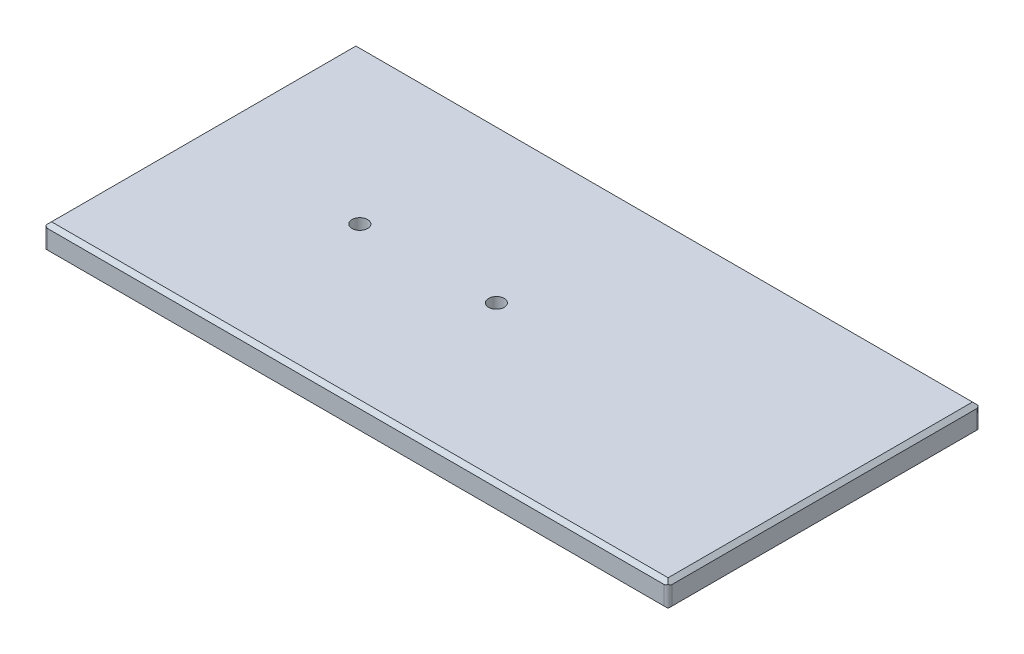
ISO-10303-21;
HEADER;
FILE_DESCRIPTION(('STEP AP214'),'2;1');
FILE_NAME('part.step','',(''),(''),'','','');
FILE_SCHEMA(('AUTOMOTIVE_DESIGN { 1 0 10303 214 1 1 1 1 }'));
ENDSEC;
DATA;
#1=APPLICATION_CONTEXT('core data for automotive mechanical design processes');
#2=APPLICATION_PROTOCOL_DEFINITION('international standard','automotive_design',2000,#1);
#3=PRODUCT_CONTEXT('',#1,'mechanical');
#4=PRODUCT('Part','Part','',(#3));
#5=PRODUCT_RELATED_PRODUCT_CATEGORY('part','',(#4));
#6=PRODUCT_DEFINITION_FORMATION('','',#4);
#7=PRODUCT_DEFINITION_CONTEXT('part definition',#1,'design');
#8=PRODUCT_DEFINITION('design','',#6,#7);
#9=PRODUCT_DEFINITION_SHAPE('','',#8);
#10=(LENGTH_UNIT() NAMED_UNIT(*) SI_UNIT(.MILLI.,.METRE.));
#11=(NAMED_UNIT(*) PLANE_ANGLE_UNIT() SI_UNIT($,.RADIAN.));
#12=(NAMED_UNIT(*) SI_UNIT($,.STERADIAN.) SOLID_ANGLE_UNIT());
#13=UNCERTAINTY_MEASURE_WITH_UNIT(LENGTH_MEASURE(1.E-05),#10,'distance_accuracy_value','');
#14=(GEOMETRIC_REPRESENTATION_CONTEXT(3) GLOBAL_UNCERTAINTY_ASSIGNED_CONTEXT((#13)) GLOBAL_UNIT_ASSIGNED_CONTEXT((#10,
#11,#12)) REPRESENTATION_CONTEXT('',''));
#15=CARTESIAN_POINT('',(0.,0.,0.));
#16=DIRECTION('',(0.,0.,1.));
#17=DIRECTION('',(1.,0.,0.));
#18=AXIS2_PLACEMENT_3D('',#15,#16,#17);
#19=CARTESIAN_POINT('',(-80.,6.,-40.));
#20=DIRECTION('',(1.,0.,0.));
#21=DIRECTION('',(0.,0.,-1.));
#22=AXIS2_PLACEMENT_3D('',#19,#20,#21);
#23=PLANE('',#22);
#24=DIRECTION('',(0.,0.,-1.));
#25=VECTOR('',#24,1.);
#26=CARTESIAN_POINT('',(-80.,4.99999999999997,-40.));
#27=LINE('',#26,#25);
#28=CARTESIAN_POINT('',(-80.,4.99999999999997,39.));
#29=VERTEX_POINT('',#28);
#30=CARTESIAN_POINT('',(-80.,4.99999999999997,-39.));
#31=VERTEX_POINT('',#30);
#32=EDGE_CURVE('E203',#29,#31,#27,.T.);
#33=ORIENTED_EDGE('',*,*,#32,.T.);
#34=DIRECTION('',(0.,-1.,0.));
#35=VECTOR('',#34,1.);
#36=CARTESIAN_POINT('',(-80.,6.,-39.));
#37=LINE('',#36,#35);
#38=CARTESIAN_POINT('',(-80.,0.199999999999978,-39.));
#39=VERTEX_POINT('',#38);
#40=EDGE_CURVE('E263',#31,#39,#37,.T.);
#41=ORIENTED_EDGE('',*,*,#40,.T.);
#42=DIRECTION('',(0.,0.,1.));
#43=VECTOR('',#42,1.);
#44=CARTESIAN_POINT('',(-80.,0.199999999999978,40.));
#45=LINE('',#44,#43);
#46=CARTESIAN_POINT('',(-80.,0.199999999999978,39.));
#47=VERTEX_POINT('',#46);
#48=EDGE_CURVE('E240',#39,#47,#45,.T.);
#49=ORIENTED_EDGE('',*,*,#48,.T.);
#50=DIRECTION('',(0.,-1.,0.));
#51=VECTOR('',#50,1.);
#52=CARTESIAN_POINT('',(-80.,6.,39.));
#53=LINE('',#52,#51);
#54=EDGE_CURVE('E260',#47,#29,#53,.F.);
#55=ORIENTED_EDGE('',*,*,#54,.T.);
#56=EDGE_LOOP('',(#33,#41,#49,#55));
#57=FACE_BOUND('',#56,.T.);
#58=ADVANCED_FACE('F42',(#57),#23,.F.);
#59=CARTESIAN_POINT('',(80.,6.,40.));
#60=DIRECTION('',(0.,0.,-1.));
#61=DIRECTION('',(-1.,0.,0.));
#62=AXIS2_PLACEMENT_3D('',#59,#60,#61);
#63=PLANE('',#62);
#64=DIRECTION('',(1.,0.,0.));
#65=VECTOR('',#64,1.);
#66=CARTESIAN_POINT('',(80.,0.199999999999978,40.));
#67=LINE('',#66,#65);
#68=CARTESIAN_POINT('',(-79.,0.199999999999978,40.));
#69=VERTEX_POINT('',#68);
#70=CARTESIAN_POINT('',(79.,0.199999999999978,40.));
#71=VERTEX_POINT('',#70);
#72=EDGE_CURVE('E206',#69,#71,#67,.T.);
#73=ORIENTED_EDGE('',*,*,#72,.T.);
#74=DIRECTION('',(0.,-1.,0.));
#75=VECTOR('',#74,1.);
#76=CARTESIAN_POINT('',(79.,6.,40.));
#77=LINE('',#76,#75);
#78=CARTESIAN_POINT('',(79.,4.99999999999997,40.));
#79=VERTEX_POINT('',#78);
#80=EDGE_CURVE('E64',#71,#79,#77,.F.);
#81=ORIENTED_EDGE('',*,*,#80,.T.);
#82=DIRECTION('',(-1.,0.,0.));
#83=VECTOR('',#82,1.);
#84=CARTESIAN_POINT('',(80.,4.99999999999997,40.));
#85=LINE('',#84,#83);
#86=CARTESIAN_POINT('',(-79.,4.99999999999997,40.));
#87=VERTEX_POINT('',#86);
#88=EDGE_CURVE('E200',#79,#87,#85,.T.);
#89=ORIENTED_EDGE('',*,*,#88,.T.);
#90=DIRECTION('',(0.,-1.,0.));
#91=VECTOR('',#90,1.);
#92=CARTESIAN_POINT('',(-79.,6.,40.));
#93=LINE('',#92,#91);
#94=EDGE_CURVE('E334',#87,#69,#93,.T.);
#95=ORIENTED_EDGE('',*,*,#94,.T.);
#96=EDGE_LOOP('',(#73,#81,#89,#95));
#97=FACE_BOUND('',#96,.T.);
#98=ADVANCED_FACE('F386',(#97),#63,.F.);
#99=CARTESIAN_POINT('',(80.,6.,-40.));
#100=DIRECTION('',(-1.,0.,0.));
#101=DIRECTION('',(0.,0.,1.));
#102=AXIS2_PLACEMENT_3D('',#99,#100,#101);
#103=PLANE('',#102);
#104=DIRECTION('',(0.,0.,-1.));
#105=VECTOR('',#104,1.);
#106=CARTESIAN_POINT('',(80.,0.199999999999978,-40.));
#107=LINE('',#106,#105);
#108=CARTESIAN_POINT('',(80.,0.199999999999978,39.));
#109=VERTEX_POINT('',#108);
#110=CARTESIAN_POINT('',(80.,0.199999999999978,-39.));
#111=VERTEX_POINT('',#110);
#112=EDGE_CURVE('E232',#109,#111,#107,.T.);
#113=ORIENTED_EDGE('',*,*,#112,.T.);
#114=DIRECTION('',(0.,-1.,0.));
#115=VECTOR('',#114,1.);
#116=CARTESIAN_POINT('',(80.,6.,-39.));
#117=LINE('',#116,#115);
#118=CARTESIAN_POINT('',(80.,4.99999999999997,-39.));
#119=VERTEX_POINT('',#118);
#120=EDGE_CURVE('E319',#111,#119,#117,.F.);
#121=ORIENTED_EDGE('',*,*,#120,.T.);
#122=DIRECTION('',(0.,0.,1.));
#123=VECTOR('',#122,1.);
#124=CARTESIAN_POINT('',(80.,4.99999999999997,-40.));
#125=LINE('',#124,#123);
#126=CARTESIAN_POINT('',(80.,4.99999999999997,39.));
#127=VERTEX_POINT('',#126);
#128=EDGE_CURVE('E191',#119,#127,#125,.T.);
#129=ORIENTED_EDGE('',*,*,#128,.T.);
#130=DIRECTION('',(0.,-1.,0.));
#131=VECTOR('',#130,1.);
#132=CARTESIAN_POINT('',(80.,6.,39.));
#133=LINE('',#132,#131);
#134=EDGE_CURVE('E315',#127,#109,#133,.T.);
#135=ORIENTED_EDGE('',*,*,#134,.T.);
#136=EDGE_LOOP('',(#113,#121,#129,#135));
#137=FACE_BOUND('',#136,.T.);
#138=ADVANCED_FACE('F396',(#137),#103,.F.);
#139=CARTESIAN_POINT('',(80.,6.,-40.));
#140=DIRECTION('',(0.,0.,1.));
#141=DIRECTION('',(1.,0.,0.));
#142=AXIS2_PLACEMENT_3D('',#139,#140,#141);
#143=PLANE('',#142);
#144=DIRECTION('',(-1.,0.,0.));
#145=VECTOR('',#144,1.);
#146=CARTESIAN_POINT('',(-80.,0.199999999999978,-40.));
#147=LINE('',#146,#145);
#148=CARTESIAN_POINT('',(79.,0.199999999999978,-40.));
#149=VERTEX_POINT('',#148);
#150=CARTESIAN_POINT('',(-79.,0.199999999999978,-40.));
#151=VERTEX_POINT('',#150);
#152=EDGE_CURVE('E236',#149,#151,#147,.T.);
#153=ORIENTED_EDGE('',*,*,#152,.T.);
#154=DIRECTION('',(0.,-1.,0.));
#155=VECTOR('',#154,1.);
#156=CARTESIAN_POINT('',(-79.,6.,-40.));
#157=LINE('',#156,#155);
#158=CARTESIAN_POINT('',(-79.,4.99999999999997,-40.));
#159=VERTEX_POINT('',#158);
#160=EDGE_CURVE('E295',#151,#159,#157,.F.);
#161=ORIENTED_EDGE('',*,*,#160,.T.);
#162=DIRECTION('',(1.,0.,0.));
#163=VECTOR('',#162,1.);
#164=CARTESIAN_POINT('',(80.,4.99999999999997,-40.));
#165=LINE('',#164,#163);
#166=CARTESIAN_POINT('',(79.,4.99999999999997,-40.));
#167=VERTEX_POINT('',#166);
#168=EDGE_CURVE('E186',#159,#167,#165,.T.);
#169=ORIENTED_EDGE('',*,*,#168,.T.);
#170=DIRECTION('',(0.,-1.,0.));
#171=VECTOR('',#170,1.);
#172=CARTESIAN_POINT('',(79.,6.,-40.));
#173=LINE('',#172,#171);
#174=EDGE_CURVE('E291',#167,#149,#173,.T.);
#175=ORIENTED_EDGE('',*,*,#174,.T.);
#176=EDGE_LOOP('',(#153,#161,#169,#175));
#177=FACE_BOUND('',#176,.T.);
#178=ADVANCED_FACE('F366',(#177),#143,.F.);
#179=CARTESIAN_POINT('',(0.,6.,0.));
#180=DIRECTION('',(0.,-1.,0.));
#181=DIRECTION('',(0.,0.,-1.));
#182=AXIS2_PLACEMENT_3D('',#179,#180,#181);
#183=PLANE('',#182);
#184=CARTESIAN_POINT('',(-39.,6.,0.));
#185=DIRECTION('',(0.,1.,0.));
#186=DIRECTION('',(0.,0.,1.));
#187=AXIS2_PLACEMENT_3D('',#184,#185,#186);
#188=CIRCLE('',#187,2.);
#189=CARTESIAN_POINT('',(-39.,6.,1.99999999999999));
#190=VERTEX_POINT('',#189);
#191=EDGE_CURVE('E169',#190,#190,#188,.T.);
#192=ORIENTED_EDGE('',*,*,#191,.F.);
#193=EDGE_LOOP('',(#192));
#194=FACE_BOUND('',#193,.T.);
#195=CARTESIAN_POINT('',(-3.99999999999996,6.,0.));
#196=DIRECTION('',(0.,1.,0.));
#197=DIRECTION('',(0.,0.,1.));
#198=AXIS2_PLACEMENT_3D('',#195,#196,#197);
#199=CIRCLE('',#198,2.);
#200=CARTESIAN_POINT('',(-3.99999999999996,6.,1.99999999999999));
#201=VERTEX_POINT('',#200);
#202=EDGE_CURVE('E341',#201,#201,#199,.T.);
#203=ORIENTED_EDGE('',*,*,#202,.F.);
#204=EDGE_LOOP('',(#203));
#205=FACE_BOUND('',#204,.T.);
#206=DIRECTION('',(0.,0.,-1.));
#207=VECTOR('',#206,1.);
#208=CARTESIAN_POINT('',(79.,6.,0.));
#209=LINE('',#208,#207);
#210=CARTESIAN_POINT('',(79.,6.,39.));
#211=VERTEX_POINT('',#210);
#212=CARTESIAN_POINT('',(79.,6.,-39.));
#213=VERTEX_POINT('',#212);
#214=EDGE_CURVE('E183',#211,#213,#209,.T.);
#215=ORIENTED_EDGE('',*,*,#214,.T.);
#216=DIRECTION('',(-1.,0.,0.));
#217=VECTOR('',#216,1.);
#218=CARTESIAN_POINT('',(0.,6.,-39.));
#219=LINE('',#218,#217);
#220=CARTESIAN_POINT('',(-79.,6.,-39.));
#221=VERTEX_POINT('',#220);
#222=EDGE_CURVE('E162',#213,#221,#219,.T.);
#223=ORIENTED_EDGE('',*,*,#222,.T.);
#224=DIRECTION('',(0.,0.,1.));
#225=VECTOR('',#224,1.);
#226=CARTESIAN_POINT('',(-79.,6.,0.));
#227=LINE('',#226,#225);
#228=CARTESIAN_POINT('',(-79.,6.,39.));
#229=VERTEX_POINT('',#228);
#230=EDGE_CURVE('E172',#221,#229,#227,.T.);
#231=ORIENTED_EDGE('',*,*,#230,.T.);
#232=DIRECTION('',(1.,0.,0.));
#233=VECTOR('',#232,1.);
#234=CARTESIAN_POINT('',(0.,6.,39.));
#235=LINE('',#234,#233);
#236=EDGE_CURVE('E178',#229,#211,#235,.T.);
#237=ORIENTED_EDGE('',*,*,#236,.T.);
#238=EDGE_LOOP('',(#215,#223,#231,#237));
#239=FACE_BOUND('',#238,.T.);
#240=ADVANCED_FACE('F181',(#194,#205,#239),#183,.F.);
#241=CARTESIAN_POINT('',(0.,0.,0.));
#242=DIRECTION('',(0.,-1.,0.));
#243=DIRECTION('',(0.,0.,-1.));
#244=AXIS2_PLACEMENT_3D('',#241,#242,#243);
#245=PLANE('',#244);
#246=CARTESIAN_POINT('',(-39.,0.,0.));
#247=DIRECTION('',(0.,-1.,0.));
#248=DIRECTION('',(0.,0.,-1.));
#249=AXIS2_PLACEMENT_3D('',#246,#247,#248);
#250=CIRCLE('',#249,2.49999999999995);
#251=CARTESIAN_POINT('',(-39.,0.,-2.49999999999996));
#252=VERTEX_POINT('',#251);
#253=EDGE_CURVE('E248',#252,#252,#250,.F.);
#254=ORIENTED_EDGE('',*,*,#253,.T.);
#255=EDGE_LOOP('',(#254));
#256=FACE_BOUND('',#255,.T.);
#257=CARTESIAN_POINT('',(-3.99999999999996,0.,0.));
#258=DIRECTION('',(0.,-1.,0.));
#259=DIRECTION('',(0.,0.,-1.));
#260=AXIS2_PLACEMENT_3D('',#257,#258,#259);
#261=CIRCLE('',#260,2.49999999999995);
#262=CARTESIAN_POINT('',(-3.99999999999996,0.,-2.49999999999996));
#263=VERTEX_POINT('',#262);
#264=EDGE_CURVE('E244',#263,#263,#261,.F.);
#265=ORIENTED_EDGE('',*,*,#264,.T.);
#266=EDGE_LOOP('',(#265));
#267=FACE_BOUND('',#266,.T.);
#268=DIRECTION('',(0.,0.,-1.));
#269=VECTOR('',#268,1.);
#270=CARTESIAN_POINT('',(-79.8,0.,-40.));
#271=LINE('',#270,#269);
#272=CARTESIAN_POINT('',(-79.8,0.,39.6));
#273=VERTEX_POINT('',#272);
#274=CARTESIAN_POINT('',(-79.8,0.,-39.6));
#275=VERTEX_POINT('',#274);
#276=EDGE_CURVE('E217',#273,#275,#271,.T.);
#277=ORIENTED_EDGE('',*,*,#276,.T.);
#278=CARTESIAN_POINT('',(-79.,0.,-39.));
#279=DIRECTION('',(0.,-1.,0.));
#280=DIRECTION('',(0.,0.,-1.));
#281=AXIS2_PLACEMENT_3D('',#278,#279,#280);
#282=CIRCLE('',#281,1.);
#283=CARTESIAN_POINT('',(-79.6,0.,-39.8));
#284=VERTEX_POINT('',#283);
#285=EDGE_CURVE('E282',#275,#284,#282,.T.);
#286=ORIENTED_EDGE('',*,*,#285,.T.);
#287=DIRECTION('',(1.,0.,0.));
#288=VECTOR('',#287,1.);
#289=CARTESIAN_POINT('',(80.,0.,-39.8));
#290=LINE('',#289,#288);
#291=CARTESIAN_POINT('',(79.6,0.,-39.8));
#292=VERTEX_POINT('',#291);
#293=EDGE_CURVE('E220',#284,#292,#290,.T.);
#294=ORIENTED_EDGE('',*,*,#293,.T.);
#295=CARTESIAN_POINT('',(79.,0.,-39.));
#296=DIRECTION('',(0.,-1.,0.));
#297=DIRECTION('',(0.,0.,-1.));
#298=AXIS2_PLACEMENT_3D('',#295,#296,#297);
#299=CIRCLE('',#298,1.);
#300=CARTESIAN_POINT('',(79.8,0.,-39.6));
#301=VERTEX_POINT('',#300);
#302=EDGE_CURVE('E279',#292,#301,#299,.T.);
#303=ORIENTED_EDGE('',*,*,#302,.T.);
#304=DIRECTION('',(0.,0.,1.));
#305=VECTOR('',#304,1.);
#306=CARTESIAN_POINT('',(79.8,0.,40.));
#307=LINE('',#306,#305);
#308=CARTESIAN_POINT('',(79.8,0.,39.6));
#309=VERTEX_POINT('',#308);
#310=EDGE_CURVE('E224',#301,#309,#307,.T.);
#311=ORIENTED_EDGE('',*,*,#310,.T.);
#312=CARTESIAN_POINT('',(79.,0.,39.));
#313=DIRECTION('',(0.,-1.,0.));
#314=DIRECTION('',(0.,0.,-1.));
#315=AXIS2_PLACEMENT_3D('',#312,#313,#314);
#316=CIRCLE('',#315,1.);
#317=CARTESIAN_POINT('',(79.6000000000001,0.,39.8));
#318=VERTEX_POINT('',#317);
#319=EDGE_CURVE('E276',#309,#318,#316,.T.);
#320=ORIENTED_EDGE('',*,*,#319,.T.);
#321=DIRECTION('',(-1.,0.,0.));
#322=VECTOR('',#321,1.);
#323=CARTESIAN_POINT('',(-80.,0.,39.8));
#324=LINE('',#323,#322);
#325=CARTESIAN_POINT('',(-79.6,0.,39.8));
#326=VERTEX_POINT('',#325);
#327=EDGE_CURVE('E228',#318,#326,#324,.T.);
#328=ORIENTED_EDGE('',*,*,#327,.T.);
#329=CARTESIAN_POINT('',(-79.,0.,39.));
#330=DIRECTION('',(0.,-1.,0.));
#331=DIRECTION('',(0.,0.,-1.));
#332=AXIS2_PLACEMENT_3D('',#329,#330,#331);
#333=CIRCLE('',#332,1.);
#334=EDGE_CURVE('E273',#326,#273,#333,.T.);
#335=ORIENTED_EDGE('',*,*,#334,.T.);
#336=EDGE_LOOP('',(#277,#286,#294,#303,#311,#320,#328,#335));
#337=FACE_BOUND('',#336,.T.);
#338=ADVANCED_FACE('F403',(#256,#267,#337),#245,.T.);
#339=CARTESIAN_POINT('',(0.,6.,39.));
#340=DIRECTION('',(0.,-0.707106781186549,-0.707106781186546));
#341=DIRECTION('',(1.,0.,0.));
#342=AXIS2_PLACEMENT_3D('',#339,#340,#341);
#343=PLANE('',#342);
#344=ORIENTED_EDGE('',*,*,#88,.F.);
#345=CARTESIAN_POINT('',(79.,5.99999999999997,39.));
#346=DIRECTION('',(0.,-0.707106781186549,-0.707106781186546));
#347=DIRECTION('',(0.,-0.707106781186546,0.707106781186549));
#348=AXIS2_PLACEMENT_3D('',#345,#346,#347);
#349=ELLIPSE('',#348,1.41421356237309,1.);
#350=CARTESIAN_POINT('',(79.7071067811866,5.29289321881342,39.7071067811865));
#351=VERTEX_POINT('',#350);
#352=EDGE_CURVE('E11',#79,#351,#349,.F.);
#353=ORIENTED_EDGE('',*,*,#352,.T.);
#354=DIRECTION('',(-0.577350269189625,0.577350269189625,-0.577350269189627));
#355=VECTOR('',#354,1.);
#356=CARTESIAN_POINT('',(52.6666666666667,32.3333333333333,12.6666666666666));
#357=LINE('',#356,#355);
#358=EDGE_CURVE('E179',#211,#351,#357,.F.);
#359=ORIENTED_EDGE('',*,*,#358,.F.);
#360=ORIENTED_EDGE('',*,*,#236,.F.);
#361=DIRECTION('',(0.577350269189622,0.577350269189626,-0.577350269189629));
#362=VECTOR('',#361,1.);
#363=CARTESIAN_POINT('',(-66.,19.0000000000001,25.9999999999999));
#364=LINE('',#363,#362);
#365=CARTESIAN_POINT('',(-79.7071067811865,5.29289321881342,39.7071067811866));
#366=VERTEX_POINT('',#365);
#367=EDGE_CURVE('E174',#366,#229,#364,.T.);
#368=ORIENTED_EDGE('',*,*,#367,.F.);
#369=CARTESIAN_POINT('',(-79.,5.99999999999997,39.));
#370=DIRECTION('',(0.,-0.707106781186549,-0.707106781186546));
#371=DIRECTION('',(0.,-0.707106781186546,0.707106781186549));
#372=AXIS2_PLACEMENT_3D('',#369,#370,#371);
#373=ELLIPSE('',#372,1.41421356237309,1.);
#374=EDGE_CURVE('E51',#366,#87,#373,.F.);
#375=ORIENTED_EDGE('',*,*,#374,.T.);
#376=EDGE_LOOP('',(#344,#353,#359,#360,#368,#375));
#377=FACE_BOUND('',#376,.T.);
#378=ADVANCED_FACE('F351',(#377),#343,.F.);
#379=CARTESIAN_POINT('',(79.,6.,0.));
#380=DIRECTION('',(-0.707106781186548,-0.707106781186548,0.));
#381=DIRECTION('',(0.,0.,-1.));
#382=AXIS2_PLACEMENT_3D('',#379,#380,#381);
#383=PLANE('',#382);
#384=ORIENTED_EDGE('',*,*,#128,.F.);
#385=CARTESIAN_POINT('',(79.,5.99999999999997,-39.));
#386=DIRECTION('',(-0.707106781186548,-0.707106781186548,0.));
#387=DIRECTION('',(0.707106781186548,-0.707106781186548,0.));
#388=AXIS2_PLACEMENT_3D('',#385,#386,#387);
#389=ELLIPSE('',#388,1.41421356237309,1.);
#390=CARTESIAN_POINT('',(79.7071067811866,5.29289321881342,-39.7071067811866));
#391=VERTEX_POINT('',#390);
#392=EDGE_CURVE('E325',#119,#391,#389,.F.);
#393=ORIENTED_EDGE('',*,*,#392,.T.);
#394=DIRECTION('',(-0.577350269189626,0.577350269189626,0.577350269189625));
#395=VECTOR('',#394,1.);
#396=CARTESIAN_POINT('',(66.,19.,-26.));
#397=LINE('',#396,#395);
#398=EDGE_CURVE('E168',#213,#391,#397,.F.);
#399=ORIENTED_EDGE('',*,*,#398,.F.);
#400=ORIENTED_EDGE('',*,*,#214,.F.);
#401=ORIENTED_EDGE('',*,*,#358,.T.);
#402=CARTESIAN_POINT('',(79.,5.99999999999997,39.));
#403=DIRECTION('',(-0.707106781186548,-0.707106781186548,0.));
#404=DIRECTION('',(0.707106781186548,-0.707106781186548,0.));
#405=AXIS2_PLACEMENT_3D('',#402,#403,#404);
#406=ELLIPSE('',#405,1.41421356237309,1.);
#407=EDGE_CURVE('E322',#351,#127,#406,.F.);
#408=ORIENTED_EDGE('',*,*,#407,.T.);
#409=EDGE_LOOP('',(#384,#393,#399,#400,#401,#408));
#410=FACE_BOUND('',#409,.T.);
#411=ADVANCED_FACE('F356',(#410),#383,.F.);
#412=CARTESIAN_POINT('',(-79.,6.,0.));
#413=DIRECTION('',(0.70710678118655,-0.707106781186545,0.));
#414=DIRECTION('',(0.,0.,1.));
#415=AXIS2_PLACEMENT_3D('',#412,#413,#414);
#416=PLANE('',#415);
#417=DIRECTION('',(-0.577350269189624,-0.577350269189628,-0.577350269189626));
#418=VECTOR('',#417,1.);
#419=CARTESIAN_POINT('',(-66.,19.,-26.));
#420=LINE('',#419,#418);
#421=CARTESIAN_POINT('',(-79.7071067811865,5.29289321881343,-39.7071067811865));
#422=VERTEX_POINT('',#421);
#423=EDGE_CURVE('E156',#422,#221,#420,.F.);
#424=ORIENTED_EDGE('',*,*,#423,.F.);
#425=CARTESIAN_POINT('',(-79.,5.99999999999998,-39.));
#426=DIRECTION('',(0.70710678118655,-0.707106781186545,0.));
#427=DIRECTION('',(-0.707106781186545,-0.70710678118655,0.));
#428=AXIS2_PLACEMENT_3D('',#425,#426,#427);
#429=ELLIPSE('',#428,1.4142135623731,1.);
#430=EDGE_CURVE('E306',#422,#31,#429,.F.);
#431=ORIENTED_EDGE('',*,*,#430,.T.);
#432=ORIENTED_EDGE('',*,*,#32,.F.);
#433=CARTESIAN_POINT('',(-79.,5.99999999999995,39.));
#434=DIRECTION('',(0.70710678118655,-0.707106781186545,0.));
#435=DIRECTION('',(-0.707106781186545,-0.70710678118655,0.));
#436=AXIS2_PLACEMENT_3D('',#433,#434,#435);
#437=ELLIPSE('',#436,1.4142135623731,1.);
#438=EDGE_CURVE('E303',#29,#366,#437,.F.);
#439=ORIENTED_EDGE('',*,*,#438,.T.);
#440=ORIENTED_EDGE('',*,*,#367,.T.);
#441=ORIENTED_EDGE('',*,*,#230,.F.);
#442=EDGE_LOOP('',(#424,#431,#432,#439,#440,#441));
#443=FACE_BOUND('',#442,.T.);
#444=ADVANCED_FACE('F173',(#443),#416,.F.);
#445=CARTESIAN_POINT('',(0.,6.,-39.));
#446=DIRECTION('',(0.,-0.707106781186546,0.707106781186549));
#447=DIRECTION('',(-1.,0.,0.));
#448=AXIS2_PLACEMENT_3D('',#445,#446,#447);
#449=PLANE('',#448);
#450=ORIENTED_EDGE('',*,*,#168,.F.);
#451=CARTESIAN_POINT('',(-79.,5.99999999999998,-39.));
#452=DIRECTION('',(0.,-0.707106781186546,0.707106781186549));
#453=DIRECTION('',(0.,-0.707106781186549,-0.707106781186546));
#454=AXIS2_PLACEMENT_3D('',#451,#452,#453);
#455=ELLIPSE('',#454,1.4142135623731,1.);
#456=EDGE_CURVE('E164',#159,#422,#455,.F.);
#457=ORIENTED_EDGE('',*,*,#456,.T.);
#458=ORIENTED_EDGE('',*,*,#423,.T.);
#459=ORIENTED_EDGE('',*,*,#222,.F.);
#460=ORIENTED_EDGE('',*,*,#398,.T.);
#461=CARTESIAN_POINT('',(79.,5.99999999999998,-39.));
#462=DIRECTION('',(0.,-0.707106781186546,0.707106781186549));
#463=DIRECTION('',(0.,-0.707106781186549,-0.707106781186546));
#464=AXIS2_PLACEMENT_3D('',#461,#462,#463);
#465=ELLIPSE('',#464,1.4142135623731,1.);
#466=EDGE_CURVE('E298',#391,#167,#465,.F.);
#467=ORIENTED_EDGE('',*,*,#466,.T.);
#468=EDGE_LOOP('',(#450,#457,#458,#459,#460,#467));
#469=FACE_BOUND('',#468,.T.);
#470=ADVANCED_FACE('F159',(#469),#449,.F.);
#471=CARTESIAN_POINT('',(80.,0.199999999999978,-40.));
#472=DIRECTION('',(0.,-0.70710678118659,-0.707106781186505));
#473=DIRECTION('',(1.,0.,0.));
#474=AXIS2_PLACEMENT_3D('',#471,#472,#473);
#475=PLANE('',#474);
#476=ORIENTED_EDGE('',*,*,#293,.F.);
#477=CARTESIAN_POINT('',(-79.,-0.799999999999902,-39.));
#478=DIRECTION('',(0.,-0.70710678118659,-0.707106781186505));
#479=DIRECTION('',(0.,-0.707106781186505,0.70710678118659));
#480=AXIS2_PLACEMENT_3D('',#477,#478,#479);
#481=ELLIPSE('',#480,1.41421356237301,1.);
#482=EDGE_CURVE('E288',#284,#151,#481,.T.);
#483=ORIENTED_EDGE('',*,*,#482,.T.);
#484=ORIENTED_EDGE('',*,*,#152,.F.);
#485=CARTESIAN_POINT('',(79.,-0.799999999999902,-39.));
#486=DIRECTION('',(0.,-0.70710678118659,-0.707106781186505));
#487=DIRECTION('',(0.,-0.707106781186505,0.70710678118659));
#488=AXIS2_PLACEMENT_3D('',#485,#486,#487);
#489=ELLIPSE('',#488,1.41421356237301,1.);
#490=EDGE_CURVE('E285',#149,#292,#489,.T.);
#491=ORIENTED_EDGE('',*,*,#490,.T.);
#492=EDGE_LOOP('',(#476,#483,#484,#491));
#493=FACE_BOUND('',#492,.T.);
#494=ADVANCED_FACE('F370',(#493),#475,.T.);
#495=CARTESIAN_POINT('',(-80.,0.199999999999978,-40.));
#496=DIRECTION('',(-0.707106781186511,-0.707106781186584,0.));
#497=DIRECTION('',(0.,0.,-1.));
#498=AXIS2_PLACEMENT_3D('',#495,#496,#497);
#499=PLANE('',#498);
#500=ORIENTED_EDGE('',*,*,#48,.F.);
#501=CARTESIAN_POINT('',(-79.,-0.799999999999919,-39.));
#502=DIRECTION('',(-0.707106781186511,-0.707106781186584,0.));
#503=DIRECTION('',(0.707106781186584,-0.707106781186511,0.));
#504=AXIS2_PLACEMENT_3D('',#501,#502,#503);
#505=ELLIPSE('',#504,1.41421356237302,1.);
#506=EDGE_CURVE('E270',#39,#275,#505,.T.);
#507=ORIENTED_EDGE('',*,*,#506,.T.);
#508=ORIENTED_EDGE('',*,*,#276,.F.);
#509=CARTESIAN_POINT('',(-79.,-0.799999999999892,39.));
#510=DIRECTION('',(-0.707106781186511,-0.707106781186584,0.));
#511=DIRECTION('',(0.707106781186584,-0.707106781186511,0.));
#512=AXIS2_PLACEMENT_3D('',#509,#510,#511);
#513=ELLIPSE('',#512,1.41421356237302,1.);
#514=EDGE_CURVE('E267',#273,#47,#513,.T.);
#515=ORIENTED_EDGE('',*,*,#514,.T.);
#516=EDGE_LOOP('',(#500,#507,#508,#515));
#517=FACE_BOUND('',#516,.T.);
#518=ADVANCED_FACE('F406',(#517),#499,.T.);
#519=CARTESIAN_POINT('',(80.,0.199999999999978,-40.));
#520=DIRECTION('',(0.707106781186499,-0.707106781186597,0.));
#521=DIRECTION('',(0.,0.,1.));
#522=AXIS2_PLACEMENT_3D('',#519,#520,#521);
#523=PLANE('',#522);
#524=ORIENTED_EDGE('',*,*,#310,.F.);
#525=CARTESIAN_POINT('',(79.,-0.799999999999884,-39.));
#526=DIRECTION('',(0.707106781186499,-0.707106781186597,0.));
#527=DIRECTION('',(-0.707106781186597,-0.707106781186499,0.));
#528=AXIS2_PLACEMENT_3D('',#525,#526,#527);
#529=ELLIPSE('',#528,1.414213562373,1.);
#530=EDGE_CURVE('E312',#301,#111,#529,.T.);
#531=ORIENTED_EDGE('',*,*,#530,.T.);
#532=ORIENTED_EDGE('',*,*,#112,.F.);
#533=CARTESIAN_POINT('',(79.,-0.799999999999884,39.));
#534=DIRECTION('',(0.707106781186499,-0.707106781186597,0.));
#535=DIRECTION('',(-0.707106781186597,-0.707106781186499,0.));
#536=AXIS2_PLACEMENT_3D('',#533,#534,#535);
#537=ELLIPSE('',#536,1.414213562373,1.);
#538=EDGE_CURVE('E309',#109,#309,#537,.T.);
#539=ORIENTED_EDGE('',*,*,#538,.T.);
#540=EDGE_LOOP('',(#524,#531,#532,#539));
#541=FACE_BOUND('',#540,.T.);
#542=ADVANCED_FACE('F401',(#541),#523,.T.);
#543=CARTESIAN_POINT('',(80.,0.199999999999978,40.));
#544=DIRECTION('',(0.,-0.707106781186603,0.707106781186492));
#545=DIRECTION('',(-1.,0.,0.));
#546=AXIS2_PLACEMENT_3D('',#543,#544,#545);
#547=PLANE('',#546);
#548=ORIENTED_EDGE('',*,*,#327,.F.);
#549=CARTESIAN_POINT('',(79.,-0.799999999999867,39.));
#550=DIRECTION('',(0.,-0.707106781186603,0.707106781186492));
#551=DIRECTION('',(0.,-0.707106781186492,-0.707106781186603));
#552=AXIS2_PLACEMENT_3D('',#549,#550,#551);
#553=ELLIPSE('',#552,1.41421356237298,1.);
#554=EDGE_CURVE('E331',#318,#71,#553,.T.);
#555=ORIENTED_EDGE('',*,*,#554,.T.);
#556=ORIENTED_EDGE('',*,*,#72,.F.);
#557=CARTESIAN_POINT('',(-79.,-0.799999999999867,39.));
#558=DIRECTION('',(0.,-0.707106781186603,0.707106781186492));
#559=DIRECTION('',(0.,-0.707106781186492,-0.707106781186603));
#560=AXIS2_PLACEMENT_3D('',#557,#558,#559);
#561=ELLIPSE('',#560,1.41421356237298,1.);
#562=EDGE_CURVE('E328',#69,#326,#561,.T.);
#563=ORIENTED_EDGE('',*,*,#562,.T.);
#564=EDGE_LOOP('',(#548,#555,#556,#563));
#565=FACE_BOUND('',#564,.T.);
#566=ADVANCED_FACE('F389',(#565),#547,.T.);
#567=CARTESIAN_POINT('',(-3.99999999999996,0.,0.));
#568=DIRECTION('',(0.,1.,0.));
#569=DIRECTION('',(0.,0.,1.));
#570=AXIS2_PLACEMENT_3D('',#567,#568,#569);
#571=CYLINDRICAL_SURFACE('',#570,2.);
#572=CARTESIAN_POINT('',(-3.99999999999996,0.499999999999951,0.));
#573=DIRECTION('',(0.,-1.,0.));
#574=DIRECTION('',(0.,0.,-1.));
#575=AXIS2_PLACEMENT_3D('',#572,#573,#574);
#576=CIRCLE('',#575,2.);
#577=CARTESIAN_POINT('',(-3.99999999999996,0.499999999999951,-2.00000000000002));
#578=VERTEX_POINT('',#577);
#579=EDGE_CURVE('E256',#578,#578,#576,.T.);
#580=ORIENTED_EDGE('',*,*,#579,.T.);
#581=EDGE_LOOP('',(#580));
#582=FACE_BOUND('',#581,.T.);
#583=ORIENTED_EDGE('',*,*,#202,.T.);
#584=EDGE_LOOP('',(#583));
#585=FACE_BOUND('',#584,.T.);
#586=ADVANCED_FACE('F432',(#582,#585),#571,.F.);
#587=CARTESIAN_POINT('',(-39.,0.,0.));
#588=DIRECTION('',(0.,1.,0.));
#589=DIRECTION('',(0.,0.,1.));
#590=AXIS2_PLACEMENT_3D('',#587,#588,#589);
#591=CYLINDRICAL_SURFACE('',#590,2.);
#592=CARTESIAN_POINT('',(-39.,0.499999999999951,0.));
#593=DIRECTION('',(0.,-1.,0.));
#594=DIRECTION('',(0.,0.,-1.));
#595=AXIS2_PLACEMENT_3D('',#592,#593,#594);
#596=CIRCLE('',#595,2.);
#597=CARTESIAN_POINT('',(-39.,0.499999999999951,-2.00000000000002));
#598=VERTEX_POINT('',#597);
#599=EDGE_CURVE('E252',#598,#598,#596,.T.);
#600=ORIENTED_EDGE('',*,*,#599,.T.);
#601=EDGE_LOOP('',(#600));
#602=FACE_BOUND('',#601,.T.);
#603=ORIENTED_EDGE('',*,*,#191,.T.);
#604=EDGE_LOOP('',(#603));
#605=FACE_BOUND('',#604,.T.);
#606=ADVANCED_FACE('F436',(#602,#605),#591,.F.);
#607=CARTESIAN_POINT('',(-39.,0.,0.));
#608=DIRECTION('',(0.,-1.,0.));
#609=DIRECTION('',(0.,0.,-1.));
#610=AXIS2_PLACEMENT_3D('',#607,#608,#609);
#611=CONICAL_SURFACE('',#610,2.49999999999995,0.785398163397441);
#612=ORIENTED_EDGE('',*,*,#599,.F.);
#613=EDGE_LOOP('',(#612));
#614=FACE_BOUND('',#613,.T.);
#615=ORIENTED_EDGE('',*,*,#253,.F.);
#616=EDGE_LOOP('',(#615));
#617=FACE_BOUND('',#616,.T.);
#618=ADVANCED_FACE('F442',(#614,#617),#611,.F.);
#619=CARTESIAN_POINT('',(-3.99999999999996,0.,0.));
#620=DIRECTION('',(0.,-1.,0.));
#621=DIRECTION('',(0.,0.,-1.));
#622=AXIS2_PLACEMENT_3D('',#619,#620,#621);
#623=CONICAL_SURFACE('',#622,2.49999999999995,0.785398163397441);
#624=ORIENTED_EDGE('',*,*,#579,.F.);
#625=EDGE_LOOP('',(#624));
#626=FACE_BOUND('',#625,.T.);
#627=ORIENTED_EDGE('',*,*,#264,.F.);
#628=EDGE_LOOP('',(#627));
#629=FACE_BOUND('',#628,.T.);
#630=ADVANCED_FACE('F509',(#626,#629),#623,.F.);
#631=CARTESIAN_POINT('',(-79.,6.,-39.));
#632=DIRECTION('',(0.,-1.,0.));
#633=DIRECTION('',(0.,0.,-1.));
#634=AXIS2_PLACEMENT_3D('',#631,#632,#633);
#635=CYLINDRICAL_SURFACE('',#634,1.);
#636=ORIENTED_EDGE('',*,*,#456,.F.);
#637=ORIENTED_EDGE('',*,*,#160,.F.);
#638=ORIENTED_EDGE('',*,*,#482,.F.);
#639=ORIENTED_EDGE('',*,*,#285,.F.);
#640=ORIENTED_EDGE('',*,*,#506,.F.);
#641=ORIENTED_EDGE('',*,*,#40,.F.);
#642=ORIENTED_EDGE('',*,*,#430,.F.);
#643=EDGE_LOOP('',(#636,#637,#638,#639,#640,#641,#642));
#644=FACE_BOUND('',#643,.T.);
#645=ADVANCED_FACE('F374',(#644),#635,.T.);
#646=CARTESIAN_POINT('',(79.,6.,-39.));
#647=DIRECTION('',(0.,-1.,0.));
#648=DIRECTION('',(0.,0.,-1.));
#649=AXIS2_PLACEMENT_3D('',#646,#647,#648);
#650=CYLINDRICAL_SURFACE('',#649,1.);
#651=ORIENTED_EDGE('',*,*,#392,.F.);
#652=ORIENTED_EDGE('',*,*,#120,.F.);
#653=ORIENTED_EDGE('',*,*,#530,.F.);
#654=ORIENTED_EDGE('',*,*,#302,.F.);
#655=ORIENTED_EDGE('',*,*,#490,.F.);
#656=ORIENTED_EDGE('',*,*,#174,.F.);
#657=ORIENTED_EDGE('',*,*,#466,.F.);
#658=EDGE_LOOP('',(#651,#652,#653,#654,#655,#656,#657));
#659=FACE_BOUND('',#658,.T.);
#660=ADVANCED_FACE('F361',(#659),#650,.T.);
#661=CARTESIAN_POINT('',(79.,6.,39.));
#662=DIRECTION('',(0.,-1.,0.));
#663=DIRECTION('',(0.,0.,-1.));
#664=AXIS2_PLACEMENT_3D('',#661,#662,#663);
#665=CYLINDRICAL_SURFACE('',#664,1.);
#666=ORIENTED_EDGE('',*,*,#352,.F.);
#667=ORIENTED_EDGE('',*,*,#80,.F.);
#668=ORIENTED_EDGE('',*,*,#554,.F.);
#669=ORIENTED_EDGE('',*,*,#319,.F.);
#670=ORIENTED_EDGE('',*,*,#538,.F.);
#671=ORIENTED_EDGE('',*,*,#134,.F.);
#672=ORIENTED_EDGE('',*,*,#407,.F.);
#673=EDGE_LOOP('',(#666,#667,#668,#669,#670,#671,#672));
#674=FACE_BOUND('',#673,.T.);
#675=ADVANCED_FACE('F393',(#674),#665,.T.);
#676=CARTESIAN_POINT('',(-79.,6.,39.));
#677=DIRECTION('',(0.,-1.,0.));
#678=DIRECTION('',(0.,0.,-1.));
#679=AXIS2_PLACEMENT_3D('',#676,#677,#678);
#680=CYLINDRICAL_SURFACE('',#679,1.);
#681=ORIENTED_EDGE('',*,*,#438,.F.);
#682=ORIENTED_EDGE('',*,*,#54,.F.);
#683=ORIENTED_EDGE('',*,*,#514,.F.);
#684=ORIENTED_EDGE('',*,*,#334,.F.);
#685=ORIENTED_EDGE('',*,*,#562,.F.);
#686=ORIENTED_EDGE('',*,*,#94,.F.);
#687=ORIENTED_EDGE('',*,*,#374,.F.);
#688=EDGE_LOOP('',(#681,#682,#683,#684,#685,#686,#687));
#689=FACE_BOUND('',#688,.T.);
#690=ADVANCED_FACE('F44',(#689),#680,.T.);
#691=CLOSED_SHELL('',(#58,#98,#138,#178,#240,#338,#378,#411,#444,#470,#494,#518,#542,#566,#586,
#606,#618,#630,#645,#660,#675,#690));
#692=MANIFOLD_SOLID_BREP('B2',#691);
#693=ADVANCED_BREP_SHAPE_REPRESENTATION('',(#18,#692),#14);
#694=SHAPE_DEFINITION_REPRESENTATION(#9,#693);
ENDSEC;
END-ISO-10303-21;
